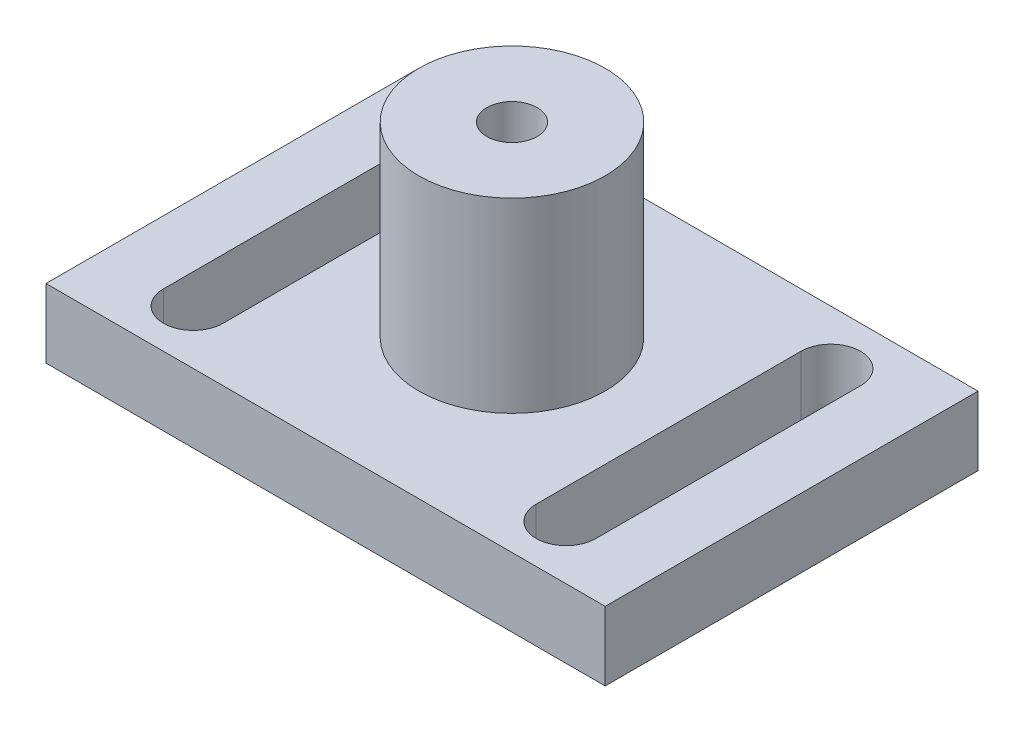
ISO-10303-21;
HEADER;
FILE_DESCRIPTION(('STEP AP214'),'2;1');
FILE_NAME('part.step','',(''),(''),'','','');
FILE_SCHEMA(('AUTOMOTIVE_DESIGN { 1 0 10303 214 1 1 1 1 }'));
ENDSEC;
DATA;
#1=APPLICATION_CONTEXT('core data for automotive mechanical design processes');
#2=APPLICATION_PROTOCOL_DEFINITION('international standard','automotive_design',2000,#1);
#3=PRODUCT_CONTEXT('',#1,'mechanical');
#4=PRODUCT('Part','Part','',(#3));
#5=PRODUCT_RELATED_PRODUCT_CATEGORY('part','',(#4));
#6=PRODUCT_DEFINITION_FORMATION('','',#4);
#7=PRODUCT_DEFINITION_CONTEXT('part definition',#1,'design');
#8=PRODUCT_DEFINITION('design','',#6,#7);
#9=PRODUCT_DEFINITION_SHAPE('','',#8);
#10=(LENGTH_UNIT() NAMED_UNIT(*) SI_UNIT(.MILLI.,.METRE.));
#11=(NAMED_UNIT(*) PLANE_ANGLE_UNIT() SI_UNIT($,.RADIAN.));
#12=(NAMED_UNIT(*) SI_UNIT($,.STERADIAN.) SOLID_ANGLE_UNIT());
#13=UNCERTAINTY_MEASURE_WITH_UNIT(LENGTH_MEASURE(1.E-05),#10,'distance_accuracy_value','');
#14=(GEOMETRIC_REPRESENTATION_CONTEXT(3) GLOBAL_UNCERTAINTY_ASSIGNED_CONTEXT((#13)) GLOBAL_UNIT_ASSIGNED_CONTEXT((#10,
#11,#12)) REPRESENTATION_CONTEXT('',''));
#15=CARTESIAN_POINT('',(0.,0.,0.));
#16=DIRECTION('',(0.,0.,1.));
#17=DIRECTION('',(1.,0.,0.));
#18=AXIS2_PLACEMENT_3D('',#15,#16,#17);
#19=CARTESIAN_POINT('',(0.,9.398,0.));
#20=DIRECTION('',(0.,1.,0.));
#21=DIRECTION('',(0.,0.,1.));
#22=AXIS2_PLACEMENT_3D('',#19,#20,#21);
#23=PLANE('',#22);
#24=CARTESIAN_POINT('',(38.1,9.398,-25.4));
#25=DIRECTION('',(0.,1.,0.));
#26=DIRECTION('',(0.,0.,1.));
#27=AXIS2_PLACEMENT_3D('',#24,#25,#26);
#28=CIRCLE('',#27,12.7);
#29=CARTESIAN_POINT('',(38.1,9.398,-12.7));
#30=VERTEX_POINT('',#29);
#31=EDGE_CURVE('E11',#30,#30,#28,.T.);
#32=ORIENTED_EDGE('',*,*,#31,.F.);
#33=EDGE_LOOP('',(#32));
#34=FACE_BOUND('',#33,.T.);
#35=DIRECTION('',(1.,0.,0.));
#36=VECTOR('',#35,1.);
#37=CARTESIAN_POINT('',(0.,9.398,-50.8));
#38=LINE('',#37,#36);
#39=CARTESIAN_POINT('',(0.,9.398,-50.8));
#40=VERTEX_POINT('',#39);
#41=CARTESIAN_POINT('',(76.2,9.398,-50.8));
#42=VERTEX_POINT('',#41);
#43=EDGE_CURVE('E223',#40,#42,#38,.T.);
#44=ORIENTED_EDGE('',*,*,#43,.F.);
#45=DIRECTION('',(0.,0.,-1.));
#46=VECTOR('',#45,1.);
#47=CARTESIAN_POINT('',(0.,9.398,0.));
#48=LINE('',#47,#46);
#49=CARTESIAN_POINT('',(0.,9.398,0.));
#50=VERTEX_POINT('',#49);
#51=EDGE_CURVE('E234',#50,#40,#48,.T.);
#52=ORIENTED_EDGE('',*,*,#51,.F.);
#53=DIRECTION('',(1.,0.,0.));
#54=VECTOR('',#53,1.);
#55=CARTESIAN_POINT('',(0.,9.398,0.));
#56=LINE('',#55,#54);
#57=CARTESIAN_POINT('',(76.2,9.398,0.));
#58=VERTEX_POINT('',#57);
#59=EDGE_CURVE('E231',#50,#58,#56,.T.);
#60=ORIENTED_EDGE('',*,*,#59,.T.);
#61=DIRECTION('',(0.,0.,-1.));
#62=VECTOR('',#61,1.);
#63=CARTESIAN_POINT('',(76.2,9.398,0.));
#64=LINE('',#63,#62);
#65=EDGE_CURVE('E227',#58,#42,#64,.T.);
#66=ORIENTED_EDGE('',*,*,#65,.T.);
#67=EDGE_LOOP('',(#44,#52,#60,#66));
#68=FACE_BOUND('',#67,.T.);
#69=CARTESIAN_POINT('',(63.5,9.398,-43.434));
#70=DIRECTION('',(0.,1.,0.));
#71=DIRECTION('',(0.,0.,1.));
#72=AXIS2_PLACEMENT_3D('',#69,#70,#71);
#73=CIRCLE('',#72,4.06400000000001);
#74=CARTESIAN_POINT('',(67.564,9.398,-43.434));
#75=VERTEX_POINT('',#74);
#76=CARTESIAN_POINT('',(59.436,9.398,-43.434));
#77=VERTEX_POINT('',#76);
#78=EDGE_CURVE('E196',#75,#77,#73,.T.);
#79=ORIENTED_EDGE('',*,*,#78,.F.);
#80=DIRECTION('',(0.,0.,1.));
#81=VECTOR('',#80,1.);
#82=CARTESIAN_POINT('',(67.564,9.398,-43.434));
#83=LINE('',#82,#81);
#84=CARTESIAN_POINT('',(67.564,9.398,-7.36600000000001));
#85=VERTEX_POINT('',#84);
#86=EDGE_CURVE('E65',#75,#85,#83,.T.);
#87=ORIENTED_EDGE('',*,*,#86,.T.);
#88=CARTESIAN_POINT('',(63.5,9.398,-7.366));
#89=DIRECTION('',(0.,-1.,0.));
#90=DIRECTION('',(0.,0.,-1.));
#91=AXIS2_PLACEMENT_3D('',#88,#89,#90);
#92=CIRCLE('',#91,4.064);
#93=CARTESIAN_POINT('',(59.436,9.398,-7.366));
#94=VERTEX_POINT('',#93);
#95=EDGE_CURVE('E205',#85,#94,#92,.T.);
#96=ORIENTED_EDGE('',*,*,#95,.T.);
#97=DIRECTION('',(0.,0.,1.));
#98=VECTOR('',#97,1.);
#99=CARTESIAN_POINT('',(59.436,9.398,-43.434));
#100=LINE('',#99,#98);
#101=EDGE_CURVE('E200',#77,#94,#100,.T.);
#102=ORIENTED_EDGE('',*,*,#101,.F.);
#103=EDGE_LOOP('',(#79,#87,#96,#102));
#104=FACE_BOUND('',#103,.T.);
#105=DIRECTION('',(0.,0.,1.));
#106=VECTOR('',#105,1.);
#107=CARTESIAN_POINT('',(8.636,9.398,-43.434));
#108=LINE('',#107,#106);
#109=CARTESIAN_POINT('',(8.636,9.398,-43.434));
#110=VERTEX_POINT('',#109);
#111=CARTESIAN_POINT('',(8.636,9.398,-7.366));
#112=VERTEX_POINT('',#111);
#113=EDGE_CURVE('E142',#110,#112,#108,.T.);
#114=ORIENTED_EDGE('',*,*,#113,.F.);
#115=CARTESIAN_POINT('',(12.7,9.398,-43.434));
#116=DIRECTION('',(0.,-1.,0.));
#117=DIRECTION('',(0.,0.,-1.));
#118=AXIS2_PLACEMENT_3D('',#115,#116,#117);
#119=CIRCLE('',#118,4.064);
#120=CARTESIAN_POINT('',(16.764,9.398,-43.434));
#121=VERTEX_POINT('',#120);
#122=EDGE_CURVE('E57',#110,#121,#119,.T.);
#123=ORIENTED_EDGE('',*,*,#122,.T.);
#124=DIRECTION('',(0.,0.,1.));
#125=VECTOR('',#124,1.);
#126=CARTESIAN_POINT('',(16.764,9.398,-43.434));
#127=LINE('',#126,#125);
#128=CARTESIAN_POINT('',(16.764,9.398,-7.366));
#129=VERTEX_POINT('',#128);
#130=EDGE_CURVE('E148',#121,#129,#127,.T.);
#131=ORIENTED_EDGE('',*,*,#130,.T.);
#132=CARTESIAN_POINT('',(12.7,9.398,-7.366));
#133=DIRECTION('',(0.,1.,0.));
#134=DIRECTION('',(0.,0.,1.));
#135=AXIS2_PLACEMENT_3D('',#132,#133,#134);
#136=CIRCLE('',#135,4.064);
#137=EDGE_CURVE('E168',#112,#129,#136,.T.);
#138=ORIENTED_EDGE('',*,*,#137,.F.);
#139=EDGE_LOOP('',(#114,#123,#131,#138));
#140=FACE_BOUND('',#139,.T.);
#141=ADVANCED_FACE('F39',(#34,#68,#104,#140),#23,.T.);
#142=CARTESIAN_POINT('',(0.,0.,0.));
#143=DIRECTION('',(0.,1.,0.));
#144=DIRECTION('',(0.,0.,1.));
#145=AXIS2_PLACEMENT_3D('',#142,#143,#144);
#146=PLANE('',#145);
#147=DIRECTION('',(0.,0.,1.));
#148=VECTOR('',#147,1.);
#149=CARTESIAN_POINT('',(67.564,0.,-43.434));
#150=LINE('',#149,#148);
#151=CARTESIAN_POINT('',(67.564,0.,-43.434));
#152=VERTEX_POINT('',#151);
#153=CARTESIAN_POINT('',(67.564,0.,-7.36600000000001));
#154=VERTEX_POINT('',#153);
#155=EDGE_CURVE('E201',#152,#154,#150,.T.);
#156=ORIENTED_EDGE('',*,*,#155,.F.);
#157=CARTESIAN_POINT('',(63.5,0.,-43.434));
#158=DIRECTION('',(0.,1.,0.));
#159=DIRECTION('',(0.,0.,1.));
#160=AXIS2_PLACEMENT_3D('',#157,#158,#159);
#161=CIRCLE('',#160,4.06400000000001);
#162=CARTESIAN_POINT('',(59.436,0.,-43.434));
#163=VERTEX_POINT('',#162);
#164=EDGE_CURVE('E195',#152,#163,#161,.T.);
#165=ORIENTED_EDGE('',*,*,#164,.T.);
#166=DIRECTION('',(0.,0.,1.));
#167=VECTOR('',#166,1.);
#168=CARTESIAN_POINT('',(59.436,0.,-43.434));
#169=LINE('',#168,#167);
#170=CARTESIAN_POINT('',(59.436,0.,-7.366));
#171=VERTEX_POINT('',#170);
#172=EDGE_CURVE('E214',#163,#171,#169,.T.);
#173=ORIENTED_EDGE('',*,*,#172,.T.);
#174=CARTESIAN_POINT('',(63.5,0.,-7.366));
#175=DIRECTION('',(0.,-1.,0.));
#176=DIRECTION('',(0.,0.,-1.));
#177=AXIS2_PLACEMENT_3D('',#174,#175,#176);
#178=CIRCLE('',#177,4.064);
#179=EDGE_CURVE('E218',#154,#171,#178,.T.);
#180=ORIENTED_EDGE('',*,*,#179,.F.);
#181=EDGE_LOOP('',(#156,#165,#173,#180));
#182=FACE_BOUND('',#181,.T.);
#183=DIRECTION('',(1.,0.,0.));
#184=VECTOR('',#183,1.);
#185=CARTESIAN_POINT('',(0.,0.,-50.8));
#186=LINE('',#185,#184);
#187=CARTESIAN_POINT('',(0.,0.,-50.8));
#188=VERTEX_POINT('',#187);
#189=CARTESIAN_POINT('',(76.2,0.,-50.8));
#190=VERTEX_POINT('',#189);
#191=EDGE_CURVE('E150',#188,#190,#186,.T.);
#192=ORIENTED_EDGE('',*,*,#191,.T.);
#193=DIRECTION('',(0.,0.,-1.));
#194=VECTOR('',#193,1.);
#195=CARTESIAN_POINT('',(76.2,0.,0.));
#196=LINE('',#195,#194);
#197=CARTESIAN_POINT('',(76.2,0.,0.));
#198=VERTEX_POINT('',#197);
#199=EDGE_CURVE('E241',#198,#190,#196,.T.);
#200=ORIENTED_EDGE('',*,*,#199,.F.);
#201=DIRECTION('',(1.,0.,0.));
#202=VECTOR('',#201,1.);
#203=CARTESIAN_POINT('',(0.,0.,0.));
#204=LINE('',#203,#202);
#205=CARTESIAN_POINT('',(0.,0.,0.));
#206=VERTEX_POINT('',#205);
#207=EDGE_CURVE('E245',#206,#198,#204,.T.);
#208=ORIENTED_EDGE('',*,*,#207,.F.);
#209=DIRECTION('',(0.,0.,-1.));
#210=VECTOR('',#209,1.);
#211=CARTESIAN_POINT('',(0.,0.,0.));
#212=LINE('',#211,#210);
#213=EDGE_CURVE('E228',#206,#188,#212,.T.);
#214=ORIENTED_EDGE('',*,*,#213,.T.);
#215=EDGE_LOOP('',(#192,#200,#208,#214));
#216=FACE_BOUND('',#215,.T.);
#217=CARTESIAN_POINT('',(12.7,0.,-43.434));
#218=DIRECTION('',(0.,-1.,0.));
#219=DIRECTION('',(0.,0.,-1.));
#220=AXIS2_PLACEMENT_3D('',#217,#218,#219);
#221=CIRCLE('',#220,4.064);
#222=CARTESIAN_POINT('',(8.636,0.,-43.434));
#223=VERTEX_POINT('',#222);
#224=CARTESIAN_POINT('',(16.764,0.,-43.434));
#225=VERTEX_POINT('',#224);
#226=EDGE_CURVE('E131',#223,#225,#221,.T.);
#227=ORIENTED_EDGE('',*,*,#226,.F.);
#228=DIRECTION('',(0.,0.,1.));
#229=VECTOR('',#228,1.);
#230=CARTESIAN_POINT('',(8.636,0.,-43.434));
#231=LINE('',#230,#229);
#232=CARTESIAN_POINT('',(8.636,0.,-7.366));
#233=VERTEX_POINT('',#232);
#234=EDGE_CURVE('E159',#223,#233,#231,.T.);
#235=ORIENTED_EDGE('',*,*,#234,.T.);
#236=CARTESIAN_POINT('',(12.7,0.,-7.366));
#237=DIRECTION('',(0.,1.,0.));
#238=DIRECTION('',(0.,0.,1.));
#239=AXIS2_PLACEMENT_3D('',#236,#237,#238);
#240=CIRCLE('',#239,4.064);
#241=CARTESIAN_POINT('',(16.764,0.,-7.366));
#242=VERTEX_POINT('',#241);
#243=EDGE_CURVE('E155',#233,#242,#240,.T.);
#244=ORIENTED_EDGE('',*,*,#243,.T.);
#245=DIRECTION('',(0.,0.,1.));
#246=VECTOR('',#245,1.);
#247=CARTESIAN_POINT('',(16.764,0.,-43.434));
#248=LINE('',#247,#246);
#249=EDGE_CURVE('E141',#225,#242,#248,.T.);
#250=ORIENTED_EDGE('',*,*,#249,.F.);
#251=EDGE_LOOP('',(#227,#235,#244,#250));
#252=FACE_BOUND('',#251,.T.);
#253=ADVANCED_FACE('F154',(#182,#216,#252),#146,.F.);
#254=CARTESIAN_POINT('',(0.,9.398,-50.8));
#255=DIRECTION('',(0.,0.,-1.));
#256=DIRECTION('',(-1.,0.,0.));
#257=AXIS2_PLACEMENT_3D('',#254,#255,#256);
#258=PLANE('',#257);
#259=ORIENTED_EDGE('',*,*,#191,.F.);
#260=DIRECTION('',(0.,-1.,0.));
#261=VECTOR('',#260,1.);
#262=CARTESIAN_POINT('',(0.,9.398,-50.8));
#263=LINE('',#262,#261);
#264=EDGE_CURVE('E49',#40,#188,#263,.T.);
#265=ORIENTED_EDGE('',*,*,#264,.F.);
#266=ORIENTED_EDGE('',*,*,#43,.T.);
#267=DIRECTION('',(0.,-1.,0.));
#268=VECTOR('',#267,1.);
#269=CARTESIAN_POINT('',(76.2,9.398,-50.8));
#270=LINE('',#269,#268);
#271=EDGE_CURVE('E43',#42,#190,#270,.T.);
#272=ORIENTED_EDGE('',*,*,#271,.T.);
#273=EDGE_LOOP('',(#259,#265,#266,#272));
#274=FACE_BOUND('',#273,.T.);
#275=ADVANCED_FACE('F41',(#274),#258,.T.);
#276=CARTESIAN_POINT('',(0.,9.398,0.));
#277=DIRECTION('',(-1.,0.,0.));
#278=DIRECTION('',(0.,0.,1.));
#279=AXIS2_PLACEMENT_3D('',#276,#277,#278);
#280=PLANE('',#279);
#281=ORIENTED_EDGE('',*,*,#213,.F.);
#282=DIRECTION('',(0.,-1.,0.));
#283=VECTOR('',#282,1.);
#284=CARTESIAN_POINT('',(0.,9.398,0.));
#285=LINE('',#284,#283);
#286=EDGE_CURVE('E253',#50,#206,#285,.T.);
#287=ORIENTED_EDGE('',*,*,#286,.F.);
#288=ORIENTED_EDGE('',*,*,#51,.T.);
#289=ORIENTED_EDGE('',*,*,#264,.T.);
#290=EDGE_LOOP('',(#281,#287,#288,#289));
#291=FACE_BOUND('',#290,.T.);
#292=ADVANCED_FACE('F272',(#291),#280,.T.);
#293=CARTESIAN_POINT('',(0.,9.398,0.));
#294=DIRECTION('',(0.,0.,-1.));
#295=DIRECTION('',(-1.,0.,0.));
#296=AXIS2_PLACEMENT_3D('',#293,#294,#295);
#297=PLANE('',#296);
#298=ORIENTED_EDGE('',*,*,#207,.T.);
#299=DIRECTION('',(0.,-1.,0.));
#300=VECTOR('',#299,1.);
#301=CARTESIAN_POINT('',(76.2,9.398,0.));
#302=LINE('',#301,#300);
#303=EDGE_CURVE('E255',#58,#198,#302,.T.);
#304=ORIENTED_EDGE('',*,*,#303,.F.);
#305=ORIENTED_EDGE('',*,*,#59,.F.);
#306=ORIENTED_EDGE('',*,*,#286,.T.);
#307=EDGE_LOOP('',(#298,#304,#305,#306));
#308=FACE_BOUND('',#307,.T.);
#309=ADVANCED_FACE('F278',(#308),#297,.F.);
#310=CARTESIAN_POINT('',(76.2,9.398,0.));
#311=DIRECTION('',(-1.,0.,0.));
#312=DIRECTION('',(0.,0.,1.));
#313=AXIS2_PLACEMENT_3D('',#310,#311,#312);
#314=PLANE('',#313);
#315=ORIENTED_EDGE('',*,*,#199,.T.);
#316=ORIENTED_EDGE('',*,*,#271,.F.);
#317=ORIENTED_EDGE('',*,*,#65,.F.);
#318=ORIENTED_EDGE('',*,*,#303,.T.);
#319=EDGE_LOOP('',(#315,#316,#317,#318));
#320=FACE_BOUND('',#319,.T.);
#321=ADVANCED_FACE('F267',(#320),#314,.F.);
#322=CARTESIAN_POINT('',(67.564,0.,-43.434));
#323=DIRECTION('',(-1.,0.,0.));
#324=DIRECTION('',(0.,0.,1.));
#325=AXIS2_PLACEMENT_3D('',#322,#323,#324);
#326=PLANE('',#325);
#327=ORIENTED_EDGE('',*,*,#86,.F.);
#328=DIRECTION('',(0.,1.,0.));
#329=VECTOR('',#328,1.);
#330=CARTESIAN_POINT('',(67.564,0.,-43.434));
#331=LINE('',#330,#329);
#332=EDGE_CURVE('E192',#152,#75,#331,.T.);
#333=ORIENTED_EDGE('',*,*,#332,.F.);
#334=ORIENTED_EDGE('',*,*,#155,.T.);
#335=DIRECTION('',(0.,1.,0.));
#336=VECTOR('',#335,1.);
#337=CARTESIAN_POINT('',(67.564,0.,-7.36600000000001));
#338=LINE('',#337,#336);
#339=EDGE_CURVE('E182',#154,#85,#338,.T.);
#340=ORIENTED_EDGE('',*,*,#339,.T.);
#341=EDGE_LOOP('',(#327,#333,#334,#340));
#342=FACE_BOUND('',#341,.T.);
#343=ADVANCED_FACE('F285',(#342),#326,.T.);
#344=CARTESIAN_POINT('',(63.5,0.,-7.366));
#345=DIRECTION('',(0.,1.,0.));
#346=DIRECTION('',(0.,0.,1.));
#347=AXIS2_PLACEMENT_3D('',#344,#345,#346);
#348=CYLINDRICAL_SURFACE('',#347,4.064);
#349=ORIENTED_EDGE('',*,*,#95,.F.);
#350=ORIENTED_EDGE('',*,*,#339,.F.);
#351=ORIENTED_EDGE('',*,*,#179,.T.);
#352=DIRECTION('',(0.,1.,0.));
#353=VECTOR('',#352,1.);
#354=CARTESIAN_POINT('',(59.436,0.,-7.366));
#355=LINE('',#354,#353);
#356=EDGE_CURVE('E185',#171,#94,#355,.T.);
#357=ORIENTED_EDGE('',*,*,#356,.T.);
#358=EDGE_LOOP('',(#349,#350,#351,#357));
#359=FACE_BOUND('',#358,.T.);
#360=ADVANCED_FACE('F348',(#359),#348,.F.);
#361=CARTESIAN_POINT('',(59.436,0.,-43.434));
#362=DIRECTION('',(-1.,0.,0.));
#363=DIRECTION('',(0.,0.,1.));
#364=AXIS2_PLACEMENT_3D('',#361,#362,#363);
#365=PLANE('',#364);
#366=ORIENTED_EDGE('',*,*,#101,.T.);
#367=ORIENTED_EDGE('',*,*,#356,.F.);
#368=ORIENTED_EDGE('',*,*,#172,.F.);
#369=DIRECTION('',(0.,1.,0.));
#370=VECTOR('',#369,1.);
#371=CARTESIAN_POINT('',(59.436,0.,-43.434));
#372=LINE('',#371,#370);
#373=EDGE_CURVE('E189',#163,#77,#372,.T.);
#374=ORIENTED_EDGE('',*,*,#373,.T.);
#375=EDGE_LOOP('',(#366,#367,#368,#374));
#376=FACE_BOUND('',#375,.T.);
#377=ADVANCED_FACE('F351',(#376),#365,.F.);
#378=CARTESIAN_POINT('',(63.5,0.,-43.434));
#379=DIRECTION('',(0.,1.,0.));
#380=DIRECTION('',(0.,0.,1.));
#381=AXIS2_PLACEMENT_3D('',#378,#379,#380);
#382=CYLINDRICAL_SURFACE('',#381,4.06400000000001);
#383=ORIENTED_EDGE('',*,*,#78,.T.);
#384=ORIENTED_EDGE('',*,*,#373,.F.);
#385=ORIENTED_EDGE('',*,*,#164,.F.);
#386=ORIENTED_EDGE('',*,*,#332,.T.);
#387=EDGE_LOOP('',(#383,#384,#385,#386));
#388=FACE_BOUND('',#387,.T.);
#389=ADVANCED_FACE('F345',(#388),#382,.F.);
#390=CARTESIAN_POINT('',(12.7,0.,-43.434));
#391=DIRECTION('',(0.,1.,0.));
#392=DIRECTION('',(0.,0.,1.));
#393=AXIS2_PLACEMENT_3D('',#390,#391,#392);
#394=CYLINDRICAL_SURFACE('',#393,4.064);
#395=ORIENTED_EDGE('',*,*,#122,.F.);
#396=DIRECTION('',(0.,1.,0.));
#397=VECTOR('',#396,1.);
#398=CARTESIAN_POINT('',(8.636,0.,-43.434));
#399=LINE('',#398,#397);
#400=EDGE_CURVE('E135',#223,#110,#399,.T.);
#401=ORIENTED_EDGE('',*,*,#400,.F.);
#402=ORIENTED_EDGE('',*,*,#226,.T.);
#403=DIRECTION('',(0.,1.,0.));
#404=VECTOR('',#403,1.);
#405=CARTESIAN_POINT('',(16.764,0.,-43.434));
#406=LINE('',#405,#404);
#407=EDGE_CURVE('E134',#225,#121,#406,.T.);
#408=ORIENTED_EDGE('',*,*,#407,.T.);
#409=EDGE_LOOP('',(#395,#401,#402,#408));
#410=FACE_BOUND('',#409,.T.);
#411=ADVANCED_FACE('F133',(#410),#394,.F.);
#412=CARTESIAN_POINT('',(16.764,0.,-43.434));
#413=DIRECTION('',(-1.,0.,0.));
#414=DIRECTION('',(0.,0.,1.));
#415=AXIS2_PLACEMENT_3D('',#412,#413,#414);
#416=PLANE('',#415);
#417=ORIENTED_EDGE('',*,*,#130,.F.);
#418=ORIENTED_EDGE('',*,*,#407,.F.);
#419=ORIENTED_EDGE('',*,*,#249,.T.);
#420=DIRECTION('',(0.,1.,0.));
#421=VECTOR('',#420,1.);
#422=CARTESIAN_POINT('',(16.764,0.,-7.366));
#423=LINE('',#422,#421);
#424=EDGE_CURVE('E151',#242,#129,#423,.T.);
#425=ORIENTED_EDGE('',*,*,#424,.T.);
#426=EDGE_LOOP('',(#417,#418,#419,#425));
#427=FACE_BOUND('',#426,.T.);
#428=ADVANCED_FACE('F145',(#427),#416,.T.);
#429=CARTESIAN_POINT('',(12.7,0.,-7.366));
#430=DIRECTION('',(0.,1.,0.));
#431=DIRECTION('',(0.,0.,1.));
#432=AXIS2_PLACEMENT_3D('',#429,#430,#431);
#433=CYLINDRICAL_SURFACE('',#432,4.064);
#434=ORIENTED_EDGE('',*,*,#137,.T.);
#435=ORIENTED_EDGE('',*,*,#424,.F.);
#436=ORIENTED_EDGE('',*,*,#243,.F.);
#437=DIRECTION('',(0.,1.,0.));
#438=VECTOR('',#437,1.);
#439=CARTESIAN_POINT('',(8.636,0.,-7.366));
#440=LINE('',#439,#438);
#441=EDGE_CURVE('E177',#233,#112,#440,.T.);
#442=ORIENTED_EDGE('',*,*,#441,.T.);
#443=EDGE_LOOP('',(#434,#435,#436,#442));
#444=FACE_BOUND('',#443,.T.);
#445=ADVANCED_FACE('F336',(#444),#433,.F.);
#446=CARTESIAN_POINT('',(8.636,0.,-43.434));
#447=DIRECTION('',(-1.,0.,0.));
#448=DIRECTION('',(0.,0.,1.));
#449=AXIS2_PLACEMENT_3D('',#446,#447,#448);
#450=PLANE('',#449);
#451=ORIENTED_EDGE('',*,*,#113,.T.);
#452=ORIENTED_EDGE('',*,*,#441,.F.);
#453=ORIENTED_EDGE('',*,*,#234,.F.);
#454=ORIENTED_EDGE('',*,*,#400,.T.);
#455=EDGE_LOOP('',(#451,#452,#453,#454));
#456=FACE_BOUND('',#455,.T.);
#457=ADVANCED_FACE('F331',(#456),#450,.F.);
#458=CARTESIAN_POINT('',(38.1,34.798,-25.4));
#459=DIRECTION('',(0.,1.,0.));
#460=DIRECTION('',(0.,0.,1.));
#461=AXIS2_PLACEMENT_3D('',#458,#459,#460);
#462=PLANE('',#461);
#463=CARTESIAN_POINT('',(38.1,34.798,-25.4));
#464=DIRECTION('',(0.,1.,0.));
#465=DIRECTION('',(0.,0.,1.));
#466=AXIS2_PLACEMENT_3D('',#463,#464,#465);
#467=CIRCLE('',#466,12.7);
#468=CARTESIAN_POINT('',(38.1,34.798,-12.7));
#469=VERTEX_POINT('',#468);
#470=EDGE_CURVE('E186',#469,#469,#467,.T.);
#471=ORIENTED_EDGE('',*,*,#470,.T.);
#472=EDGE_LOOP('',(#471));
#473=FACE_BOUND('',#472,.T.);
#474=CARTESIAN_POINT('',(38.1,34.798,-25.4));
#475=DIRECTION('',(0.,1.,0.));
#476=DIRECTION('',(0.,0.,1.));
#477=AXIS2_PLACEMENT_3D('',#474,#475,#476);
#478=CIRCLE('',#477,3.429);
#479=CARTESIAN_POINT('',(38.1,34.798,-21.971));
#480=VERTEX_POINT('',#479);
#481=EDGE_CURVE('E312',#480,#480,#478,.T.);
#482=ORIENTED_EDGE('',*,*,#481,.F.);
#483=EDGE_LOOP('',(#482));
#484=FACE_BOUND('',#483,.T.);
#485=ADVANCED_FACE('F322',(#473,#484),#462,.T.);
#486=CARTESIAN_POINT('',(38.1,34.798,-25.4));
#487=DIRECTION('',(0.,-1.,0.));
#488=DIRECTION('',(0.,0.,-1.));
#489=AXIS2_PLACEMENT_3D('',#486,#487,#488);
#490=CYLINDRICAL_SURFACE('',#489,12.7);
#491=ORIENTED_EDGE('',*,*,#470,.F.);
#492=EDGE_LOOP('',(#491));
#493=FACE_BOUND('',#492,.T.);
#494=ORIENTED_EDGE('',*,*,#31,.T.);
#495=EDGE_LOOP('',(#494));
#496=FACE_BOUND('',#495,.T.);
#497=ADVANCED_FACE('F304',(#493,#496),#490,.T.);
#498=CARTESIAN_POINT('',(38.1,34.798,-25.4));
#499=DIRECTION('',(0.,-1.,0.));
#500=DIRECTION('',(0.,0.,-1.));
#501=AXIS2_PLACEMENT_3D('',#498,#499,#500);
#502=CYLINDRICAL_SURFACE('',#501,3.429);
#503=ORIENTED_EDGE('',*,*,#481,.T.);
#504=EDGE_LOOP('',(#503));
#505=FACE_BOUND('',#504,.T.);
#506=CARTESIAN_POINT('',(38.1,9.398,-25.4));
#507=DIRECTION('',(0.,1.,0.));
#508=DIRECTION('',(0.,0.,1.));
#509=AXIS2_PLACEMENT_3D('',#506,#507,#508);
#510=CIRCLE('',#509,3.429);
#511=CARTESIAN_POINT('',(38.1,9.398,-21.971));
#512=VERTEX_POINT('',#511);
#513=EDGE_CURVE('E309',#512,#512,#510,.T.);
#514=ORIENTED_EDGE('',*,*,#513,.F.);
#515=EDGE_LOOP('',(#514));
#516=FACE_BOUND('',#515,.T.);
#517=ADVANCED_FACE('F299',(#505,#516),#502,.F.);
#518=ORIENTED_EDGE('',*,*,#513,.T.);
#519=EDGE_LOOP('',(#518));
#520=FACE_BOUND('',#519,.T.);
#521=ADVANCED_FACE('F290',(#520),#23,.T.);
#522=CLOSED_SHELL('',(#141,#253,#275,#292,#309,#321,#343,#360,#377,#389,#411,#428,#445,#457,
#485,#497,#517,#521));
#523=MANIFOLD_SOLID_BREP('B2',#522);
#524=ADVANCED_BREP_SHAPE_REPRESENTATION('',(#18,#523),#14);
#525=SHAPE_DEFINITION_REPRESENTATION(#9,#524);
ENDSEC;
END-ISO-10303-21;
